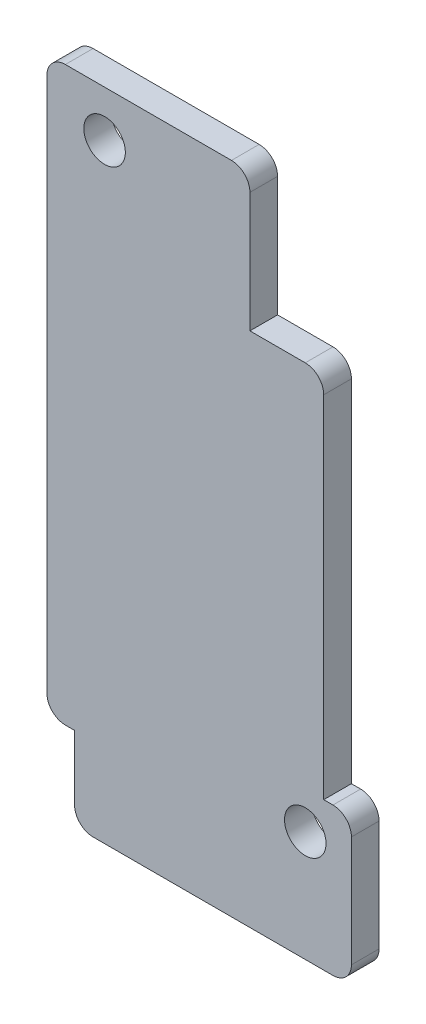
ISO-10303-21;
HEADER;
FILE_DESCRIPTION(('STEP AP214'),'2;1');
FILE_NAME('part.step','',(''),(''),'','','');
FILE_SCHEMA(('AUTOMOTIVE_DESIGN { 1 0 10303 214 1 1 1 1 }'));
ENDSEC;
DATA;
#1=APPLICATION_CONTEXT('core data for automotive mechanical design processes');
#2=APPLICATION_PROTOCOL_DEFINITION('international standard','automotive_design',2000,#1);
#3=PRODUCT_CONTEXT('',#1,'mechanical');
#4=PRODUCT('Part','Part','',(#3));
#5=PRODUCT_RELATED_PRODUCT_CATEGORY('part','',(#4));
#6=PRODUCT_DEFINITION_FORMATION('','',#4);
#7=PRODUCT_DEFINITION_CONTEXT('part definition',#1,'design');
#8=PRODUCT_DEFINITION('design','',#6,#7);
#9=PRODUCT_DEFINITION_SHAPE('','',#8);
#10=(LENGTH_UNIT() NAMED_UNIT(*) SI_UNIT(.MILLI.,.METRE.));
#11=(NAMED_UNIT(*) PLANE_ANGLE_UNIT() SI_UNIT($,.RADIAN.));
#12=(NAMED_UNIT(*) SI_UNIT($,.STERADIAN.) SOLID_ANGLE_UNIT());
#13=UNCERTAINTY_MEASURE_WITH_UNIT(LENGTH_MEASURE(1.E-05),#10,'distance_accuracy_value','');
#14=(GEOMETRIC_REPRESENTATION_CONTEXT(3) GLOBAL_UNCERTAINTY_ASSIGNED_CONTEXT((#13)) GLOBAL_UNIT_ASSIGNED_CONTEXT((#10,
#11,#12)) REPRESENTATION_CONTEXT('',''));
#15=CARTESIAN_POINT('',(0.,0.,0.));
#16=DIRECTION('',(0.,0.,1.));
#17=DIRECTION('',(1.,0.,0.));
#18=AXIS2_PLACEMENT_3D('',#15,#16,#17);
#19=CARTESIAN_POINT('',(15.9441176470588,16.0014705882353,1.5));
#20=DIRECTION('',(-1.,0.,0.));
#21=DIRECTION('',(0.,-1.,0.));
#22=AXIS2_PLACEMENT_3D('',#19,#20,#21);
#23=PLANE('',#22);
#24=DIRECTION('',(0.,1.,0.));
#25=VECTOR('',#24,1.);
#26=CARTESIAN_POINT('',(15.9441176470588,16.0014705882353,-1.5));
#27=LINE('',#26,#25);
#28=CARTESIAN_POINT('',(15.9441176470588,-38.9985294117647,-1.5));
#29=VERTEX_POINT('',#28);
#30=CARTESIAN_POINT('',(15.9441176470588,-0.998529411764711,-1.5));
#31=VERTEX_POINT('',#30);
#32=EDGE_CURVE('E239',#29,#31,#27,.T.);
#33=ORIENTED_EDGE('',*,*,#32,.T.);
#34=DIRECTION('',(0.,0.,1.));
#35=VECTOR('',#34,1.);
#36=CARTESIAN_POINT('',(15.9441176470588,-0.998529411764711,1.5));
#37=LINE('',#36,#35);
#38=CARTESIAN_POINT('',(15.9441176470588,-0.998529411764711,1.5));
#39=VERTEX_POINT('',#38);
#40=EDGE_CURVE('E290',#31,#39,#37,.T.);
#41=ORIENTED_EDGE('',*,*,#40,.T.);
#42=DIRECTION('',(0.,1.,0.));
#43=VECTOR('',#42,1.);
#44=CARTESIAN_POINT('',(15.9441176470588,16.0014705882353,1.5));
#45=LINE('',#44,#43);
#46=CARTESIAN_POINT('',(15.9441176470588,-38.9985294117647,1.5));
#47=VERTEX_POINT('',#46);
#48=EDGE_CURVE('E228',#47,#39,#45,.T.);
#49=ORIENTED_EDGE('',*,*,#48,.F.);
#50=DIRECTION('',(0.,0.,1.));
#51=VECTOR('',#50,1.);
#52=CARTESIAN_POINT('',(15.9441176470588,-38.9985294117647,-1.5));
#53=LINE('',#52,#51);
#54=EDGE_CURVE('E195',#29,#47,#53,.T.);
#55=ORIENTED_EDGE('',*,*,#54,.F.);
#56=EDGE_LOOP('',(#33,#41,#49,#55));
#57=FACE_BOUND('',#56,.T.);
#58=ADVANCED_FACE('F37',(#57),#23,.F.);
#59=CARTESIAN_POINT('',(-14.0558823529412,16.0014705882353,1.5));
#60=DIRECTION('',(1.,0.,0.));
#61=DIRECTION('',(0.,1.,0.));
#62=AXIS2_PLACEMENT_3D('',#59,#60,#61);
#63=PLANE('',#62);
#64=DIRECTION('',(0.,-1.,0.));
#65=VECTOR('',#64,1.);
#66=CARTESIAN_POINT('',(-14.0558823529412,16.0014705882353,-1.5));
#67=LINE('',#66,#65);
#68=CARTESIAN_POINT('',(-14.0558823529412,14.0014705882353,-1.5));
#69=VERTEX_POINT('',#68);
#70=CARTESIAN_POINT('',(-14.0558823529412,-43.9985294117647,-1.5));
#71=VERTEX_POINT('',#70);
#72=EDGE_CURVE('E221',#69,#71,#67,.T.);
#73=ORIENTED_EDGE('',*,*,#72,.T.);
#74=DIRECTION('',(0.,0.,-1.));
#75=VECTOR('',#74,1.);
#76=CARTESIAN_POINT('',(-14.0558823529412,-43.9985294117647,1.5));
#77=LINE('',#76,#75);
#78=CARTESIAN_POINT('',(-14.0558823529412,-43.9985294117647,1.5));
#79=VERTEX_POINT('',#78);
#80=EDGE_CURVE('E60',#71,#79,#77,.F.);
#81=ORIENTED_EDGE('',*,*,#80,.T.);
#82=DIRECTION('',(0.,-1.,0.));
#83=VECTOR('',#82,1.);
#84=CARTESIAN_POINT('',(-14.0558823529412,16.0014705882353,1.5));
#85=LINE('',#84,#83);
#86=CARTESIAN_POINT('',(-14.0558823529412,14.0014705882353,1.5));
#87=VERTEX_POINT('',#86);
#88=EDGE_CURVE('E222',#87,#79,#85,.T.);
#89=ORIENTED_EDGE('',*,*,#88,.F.);
#90=DIRECTION('',(0.,0.,-1.));
#91=VECTOR('',#90,1.);
#92=CARTESIAN_POINT('',(-14.0558823529412,14.0014705882353,1.5));
#93=LINE('',#92,#91);
#94=EDGE_CURVE('E278',#87,#69,#93,.T.);
#95=ORIENTED_EDGE('',*,*,#94,.T.);
#96=EDGE_LOOP('',(#73,#81,#89,#95));
#97=FACE_BOUND('',#96,.T.);
#98=ADVANCED_FACE('F308',(#97),#63,.F.);
#99=CARTESIAN_POINT('',(-14.0558823529412,-54.9985294117647,1.5));
#100=DIRECTION('',(0.,1.,0.));
#101=DIRECTION('',(0.,0.,1.));
#102=AXIS2_PLACEMENT_3D('',#99,#100,#101);
#103=PLANE('',#102);
#104=DIRECTION('',(1.,0.,0.));
#105=VECTOR('',#104,1.);
#106=CARTESIAN_POINT('',(-14.0558823529412,-54.9985294117647,1.5));
#107=LINE('',#106,#105);
#108=CARTESIAN_POINT('',(-9.05588235294117,-54.9985294117647,1.5));
#109=VERTEX_POINT('',#108);
#110=CARTESIAN_POINT('',(16.9441176470588,-54.9985294117647,1.5));
#111=VERTEX_POINT('',#110);
#112=EDGE_CURVE('E224',#109,#111,#107,.T.);
#113=ORIENTED_EDGE('',*,*,#112,.F.);
#114=DIRECTION('',(0.,0.,-1.));
#115=VECTOR('',#114,1.);
#116=CARTESIAN_POINT('',(-9.05588235294116,-54.9985294117647,1.5));
#117=LINE('',#116,#115);
#118=CARTESIAN_POINT('',(-9.05588235294117,-54.9985294117647,-1.5));
#119=VERTEX_POINT('',#118);
#120=EDGE_CURVE('E245',#109,#119,#117,.T.);
#121=ORIENTED_EDGE('',*,*,#120,.T.);
#122=DIRECTION('',(1.,0.,0.));
#123=VECTOR('',#122,1.);
#124=CARTESIAN_POINT('',(-14.0558823529412,-54.9985294117647,-1.5));
#125=LINE('',#124,#123);
#126=CARTESIAN_POINT('',(16.9441176470588,-54.9985294117647,-1.5));
#127=VERTEX_POINT('',#126);
#128=EDGE_CURVE('E236',#119,#127,#125,.T.);
#129=ORIENTED_EDGE('',*,*,#128,.T.);
#130=DIRECTION('',(0.,0.,-1.));
#131=VECTOR('',#130,1.);
#132=CARTESIAN_POINT('',(16.9441176470588,-54.9985294117647,1.5));
#133=LINE('',#132,#131);
#134=EDGE_CURVE('E234',#127,#111,#133,.F.);
#135=ORIENTED_EDGE('',*,*,#134,.T.);
#136=EDGE_LOOP('',(#113,#121,#129,#135));
#137=FACE_BOUND('',#136,.T.);
#138=ADVANCED_FACE('F333',(#137),#103,.F.);
#139=CARTESIAN_POINT('',(-14.0558823529412,16.0014705882353,1.5));
#140=DIRECTION('',(0.,-1.,0.));
#141=DIRECTION('',(0.,0.,-1.));
#142=AXIS2_PLACEMENT_3D('',#139,#140,#141);
#143=PLANE('',#142);
#144=DIRECTION('',(-1.,0.,0.));
#145=VECTOR('',#144,1.);
#146=CARTESIAN_POINT('',(-14.0558823529412,16.0014705882353,1.5));
#147=LINE('',#146,#145);
#148=CARTESIAN_POINT('',(5.94411764705882,16.0014705882353,1.5));
#149=VERTEX_POINT('',#148);
#150=CARTESIAN_POINT('',(-12.0558823529412,16.0014705882353,1.5));
#151=VERTEX_POINT('',#150);
#152=EDGE_CURVE('E231',#149,#151,#147,.T.);
#153=ORIENTED_EDGE('',*,*,#152,.F.);
#154=DIRECTION('',(0.,0.,1.));
#155=VECTOR('',#154,1.);
#156=CARTESIAN_POINT('',(5.94411764705882,16.0014705882353,1.5));
#157=LINE('',#156,#155);
#158=CARTESIAN_POINT('',(5.94411764705882,16.0014705882353,-1.5));
#159=VERTEX_POINT('',#158);
#160=EDGE_CURVE('E11',#149,#159,#157,.F.);
#161=ORIENTED_EDGE('',*,*,#160,.T.);
#162=DIRECTION('',(-1.,0.,0.));
#163=VECTOR('',#162,1.);
#164=CARTESIAN_POINT('',(-14.0558823529412,16.0014705882353,-1.5));
#165=LINE('',#164,#163);
#166=CARTESIAN_POINT('',(-12.0558823529412,16.0014705882353,-1.5));
#167=VERTEX_POINT('',#166);
#168=EDGE_CURVE('E225',#159,#167,#165,.T.);
#169=ORIENTED_EDGE('',*,*,#168,.T.);
#170=DIRECTION('',(0.,0.,-1.));
#171=VECTOR('',#170,1.);
#172=CARTESIAN_POINT('',(-12.0558823529412,16.0014705882353,1.5));
#173=LINE('',#172,#171);
#174=EDGE_CURVE('E45',#167,#151,#173,.F.);
#175=ORIENTED_EDGE('',*,*,#174,.T.);
#176=EDGE_LOOP('',(#153,#161,#169,#175));
#177=FACE_BOUND('',#176,.T.);
#178=ADVANCED_FACE('F300',(#177),#143,.F.);
#179=CARTESIAN_POINT('',(0.,0.,1.5));
#180=DIRECTION('',(0.,0.,1.));
#181=DIRECTION('',(1.,0.,0.));
#182=AXIS2_PLACEMENT_3D('',#179,#180,#181);
#183=PLANE('',#182);
#184=DIRECTION('',(0.,-1.,0.));
#185=VECTOR('',#184,1.);
#186=CARTESIAN_POINT('',(-11.0558823529412,-54.9985294117647,1.5));
#187=LINE('',#186,#185);
#188=CARTESIAN_POINT('',(-11.0558823529412,-45.9985294117647,1.5));
#189=VERTEX_POINT('',#188);
#190=CARTESIAN_POINT('',(-11.0558823529412,-52.9985294117647,1.5));
#191=VERTEX_POINT('',#190);
#192=EDGE_CURVE('E160',#189,#191,#187,.T.);
#193=ORIENTED_EDGE('',*,*,#192,.T.);
#194=CARTESIAN_POINT('',(-9.05588235294116,-52.9985294117647,1.5));
#195=DIRECTION('',(0.,0.,1.));
#196=DIRECTION('',(1.,0.,0.));
#197=AXIS2_PLACEMENT_3D('',#194,#195,#196);
#198=CIRCLE('',#197,2.);
#199=EDGE_CURVE('E274',#191,#109,#198,.T.);
#200=ORIENTED_EDGE('',*,*,#199,.T.);
#201=ORIENTED_EDGE('',*,*,#112,.T.);
#202=CARTESIAN_POINT('',(16.9441176470588,-52.9985294117647,1.5));
#203=DIRECTION('',(0.,0.,1.));
#204=DIRECTION('',(1.,0.,0.));
#205=AXIS2_PLACEMENT_3D('',#202,#203,#204);
#206=CIRCLE('',#205,2.);
#207=CARTESIAN_POINT('',(18.9441176470588,-52.9985294117647,1.5));
#208=VERTEX_POINT('',#207);
#209=EDGE_CURVE('E269',#111,#208,#206,.T.);
#210=ORIENTED_EDGE('',*,*,#209,.T.);
#211=DIRECTION('',(0.,-1.,0.));
#212=VECTOR('',#211,1.);
#213=CARTESIAN_POINT('',(18.9441176470588,-54.9985294117647,1.5));
#214=LINE('',#213,#212);
#215=CARTESIAN_POINT('',(18.9441176470588,-40.9985294117647,1.5));
#216=VERTEX_POINT('',#215);
#217=EDGE_CURVE('E199',#216,#208,#214,.T.);
#218=ORIENTED_EDGE('',*,*,#217,.F.);
#219=CARTESIAN_POINT('',(16.9441176470588,-40.9985294117647,1.5));
#220=DIRECTION('',(0.,0.,1.));
#221=DIRECTION('',(1.,0.,0.));
#222=AXIS2_PLACEMENT_3D('',#219,#220,#221);
#223=CIRCLE('',#222,2.);
#224=CARTESIAN_POINT('',(16.9441176470588,-38.9985294117647,1.5));
#225=VERTEX_POINT('',#224);
#226=EDGE_CURVE('E271',#216,#225,#223,.T.);
#227=ORIENTED_EDGE('',*,*,#226,.T.);
#228=DIRECTION('',(-1.,0.,0.));
#229=VECTOR('',#228,1.);
#230=CARTESIAN_POINT('',(18.9441176470588,-38.9985294117647,1.5));
#231=LINE('',#230,#229);
#232=EDGE_CURVE('E202',#225,#47,#231,.T.);
#233=ORIENTED_EDGE('',*,*,#232,.T.);
#234=ORIENTED_EDGE('',*,*,#48,.T.);
#235=CARTESIAN_POINT('',(13.9441176470588,-0.998529411764711,1.5));
#236=DIRECTION('',(0.,0.,1.));
#237=DIRECTION('',(1.,0.,0.));
#238=AXIS2_PLACEMENT_3D('',#235,#236,#237);
#239=CIRCLE('',#238,2.);
#240=CARTESIAN_POINT('',(13.9441176470588,1.00147058823529,1.5));
#241=VERTEX_POINT('',#240);
#242=EDGE_CURVE('E267',#39,#241,#239,.T.);
#243=ORIENTED_EDGE('',*,*,#242,.T.);
#244=DIRECTION('',(1.,0.,0.));
#245=VECTOR('',#244,1.);
#246=CARTESIAN_POINT('',(15.9441176470588,1.00147058823529,1.5));
#247=LINE('',#246,#245);
#248=CARTESIAN_POINT('',(7.94411764705882,1.00147058823529,1.5));
#249=VERTEX_POINT('',#248);
#250=EDGE_CURVE('E212',#249,#241,#247,.T.);
#251=ORIENTED_EDGE('',*,*,#250,.F.);
#252=DIRECTION('',(0.,-1.,0.));
#253=VECTOR('',#252,1.);
#254=CARTESIAN_POINT('',(7.94411764705882,16.0014705882353,1.5));
#255=LINE('',#254,#253);
#256=CARTESIAN_POINT('',(7.94411764705882,14.0014705882353,1.5));
#257=VERTEX_POINT('',#256);
#258=EDGE_CURVE('E208',#257,#249,#255,.T.);
#259=ORIENTED_EDGE('',*,*,#258,.F.);
#260=CARTESIAN_POINT('',(5.94411764705882,14.0014705882353,1.5));
#261=DIRECTION('',(0.,0.,1.));
#262=DIRECTION('',(1.,0.,0.));
#263=AXIS2_PLACEMENT_3D('',#260,#261,#262);
#264=CIRCLE('',#263,2.);
#265=EDGE_CURVE('E265',#257,#149,#264,.T.);
#266=ORIENTED_EDGE('',*,*,#265,.T.);
#267=ORIENTED_EDGE('',*,*,#152,.T.);
#268=CARTESIAN_POINT('',(-12.0558823529412,14.0014705882353,1.5));
#269=DIRECTION('',(0.,0.,1.));
#270=DIRECTION('',(1.,0.,0.));
#271=AXIS2_PLACEMENT_3D('',#268,#269,#270);
#272=CIRCLE('',#271,2.);
#273=EDGE_CURVE('E263',#151,#87,#272,.T.);
#274=ORIENTED_EDGE('',*,*,#273,.T.);
#275=ORIENTED_EDGE('',*,*,#88,.T.);
#276=CARTESIAN_POINT('',(-12.0558823529412,-43.9985294117647,1.5));
#277=DIRECTION('',(0.,0.,1.));
#278=DIRECTION('',(1.,0.,0.));
#279=AXIS2_PLACEMENT_3D('',#276,#277,#278);
#280=CIRCLE('',#279,2.);
#281=CARTESIAN_POINT('',(-12.0558823529412,-45.9985294117647,1.5));
#282=VERTEX_POINT('',#281);
#283=EDGE_CURVE('E52',#79,#282,#280,.T.);
#284=ORIENTED_EDGE('',*,*,#283,.T.);
#285=DIRECTION('',(1.,0.,0.));
#286=VECTOR('',#285,1.);
#287=CARTESIAN_POINT('',(-14.0558823529412,-45.9985294117647,1.5));
#288=LINE('',#287,#286);
#289=EDGE_CURVE('E155',#282,#189,#288,.T.);
#290=ORIENTED_EDGE('',*,*,#289,.T.);
#291=EDGE_LOOP('',(#193,#200,#201,#210,#218,#227,#233,#234,#243,#251,#259,#266,#267,#274,#275,
#284,#290));
#292=FACE_BOUND('',#291,.T.);
#293=CARTESIAN_POINT('',(-7.80588235294117,11.0014705882353,1.5));
#294=DIRECTION('',(0.,0.,-1.));
#295=DIRECTION('',(-1.,0.,0.));
#296=AXIS2_PLACEMENT_3D('',#293,#294,#295);
#297=CIRCLE('',#296,2.25);
#298=CARTESIAN_POINT('',(-10.0558823529412,11.0014705882353,1.5));
#299=VERTEX_POINT('',#298);
#300=EDGE_CURVE('E186',#299,#299,#297,.T.);
#301=ORIENTED_EDGE('',*,*,#300,.T.);
#302=EDGE_LOOP('',(#301));
#303=FACE_BOUND('',#302,.T.);
#304=CARTESIAN_POINT('',(13.9441176470588,-42.9985294117647,1.5));
#305=DIRECTION('',(0.,0.,-1.));
#306=DIRECTION('',(-1.,0.,0.));
#307=AXIS2_PLACEMENT_3D('',#304,#305,#306);
#308=CIRCLE('',#307,2.25);
#309=CARTESIAN_POINT('',(11.6941176470588,-42.9985294117647,1.5));
#310=VERTEX_POINT('',#309);
#311=EDGE_CURVE('E192',#310,#310,#308,.T.);
#312=ORIENTED_EDGE('',*,*,#311,.T.);
#313=EDGE_LOOP('',(#312));
#314=FACE_BOUND('',#313,.T.);
#315=ADVANCED_FACE('F157',(#292,#303,#314),#183,.T.);
#316=CARTESIAN_POINT('',(0.,0.,-1.5));
#317=DIRECTION('',(0.,0.,1.));
#318=DIRECTION('',(1.,0.,0.));
#319=AXIS2_PLACEMENT_3D('',#316,#317,#318);
#320=PLANE('',#319);
#321=CARTESIAN_POINT('',(-7.80588235294117,11.0014705882353,-1.5));
#322=DIRECTION('',(0.,0.,-1.));
#323=DIRECTION('',(-1.,0.,0.));
#324=AXIS2_PLACEMENT_3D('',#321,#322,#323);
#325=CIRCLE('',#324,2.25);
#326=CARTESIAN_POINT('',(-10.0558823529412,11.0014705882353,-1.5));
#327=VERTEX_POINT('',#326);
#328=EDGE_CURVE('E175',#327,#327,#325,.T.);
#329=ORIENTED_EDGE('',*,*,#328,.F.);
#330=EDGE_LOOP('',(#329));
#331=FACE_BOUND('',#330,.T.);
#332=CARTESIAN_POINT('',(13.9441176470588,-42.9985294117647,-1.5));
#333=DIRECTION('',(0.,0.,-1.));
#334=DIRECTION('',(-1.,0.,0.));
#335=AXIS2_PLACEMENT_3D('',#332,#333,#334);
#336=CIRCLE('',#335,2.25);
#337=CARTESIAN_POINT('',(11.6941176470588,-42.9985294117647,-1.5));
#338=VERTEX_POINT('',#337);
#339=EDGE_CURVE('E189',#338,#338,#336,.T.);
#340=ORIENTED_EDGE('',*,*,#339,.F.);
#341=EDGE_LOOP('',(#340));
#342=FACE_BOUND('',#341,.T.);
#343=ORIENTED_EDGE('',*,*,#128,.F.);
#344=CARTESIAN_POINT('',(-9.05588235294116,-52.9985294117647,-1.5));
#345=DIRECTION('',(0.,0.,1.));
#346=DIRECTION('',(1.,0.,0.));
#347=AXIS2_PLACEMENT_3D('',#344,#345,#346);
#348=CIRCLE('',#347,2.);
#349=CARTESIAN_POINT('',(-11.0558823529412,-52.9985294117647,-1.5));
#350=VERTEX_POINT('',#349);
#351=EDGE_CURVE('E260',#119,#350,#348,.F.);
#352=ORIENTED_EDGE('',*,*,#351,.T.);
#353=DIRECTION('',(0.,-1.,0.));
#354=VECTOR('',#353,1.);
#355=CARTESIAN_POINT('',(-11.0558823529412,-54.9985294117647,-1.5));
#356=LINE('',#355,#354);
#357=CARTESIAN_POINT('',(-11.0558823529412,-45.9985294117647,-1.5));
#358=VERTEX_POINT('',#357);
#359=EDGE_CURVE('E165',#358,#350,#356,.T.);
#360=ORIENTED_EDGE('',*,*,#359,.F.);
#361=DIRECTION('',(1.,0.,0.));
#362=VECTOR('',#361,1.);
#363=CARTESIAN_POINT('',(-14.0558823529412,-45.9985294117647,-1.5));
#364=LINE('',#363,#362);
#365=CARTESIAN_POINT('',(-12.0558823529412,-45.9985294117647,-1.5));
#366=VERTEX_POINT('',#365);
#367=EDGE_CURVE('E171',#366,#358,#364,.T.);
#368=ORIENTED_EDGE('',*,*,#367,.F.);
#369=CARTESIAN_POINT('',(-12.0558823529412,-43.9985294117647,-1.5));
#370=DIRECTION('',(0.,0.,1.));
#371=DIRECTION('',(1.,0.,0.));
#372=AXIS2_PLACEMENT_3D('',#369,#370,#371);
#373=CIRCLE('',#372,2.);
#374=EDGE_CURVE('E258',#366,#71,#373,.F.);
#375=ORIENTED_EDGE('',*,*,#374,.T.);
#376=ORIENTED_EDGE('',*,*,#72,.F.);
#377=CARTESIAN_POINT('',(-12.0558823529412,14.0014705882353,-1.5));
#378=DIRECTION('',(0.,0.,1.));
#379=DIRECTION('',(1.,0.,0.));
#380=AXIS2_PLACEMENT_3D('',#377,#378,#379);
#381=CIRCLE('',#380,2.);
#382=EDGE_CURVE('E248',#69,#167,#381,.F.);
#383=ORIENTED_EDGE('',*,*,#382,.T.);
#384=ORIENTED_EDGE('',*,*,#168,.F.);
#385=CARTESIAN_POINT('',(5.94411764705882,14.0014705882353,-1.5));
#386=DIRECTION('',(0.,0.,1.));
#387=DIRECTION('',(1.,0.,0.));
#388=AXIS2_PLACEMENT_3D('',#385,#386,#387);
#389=CIRCLE('',#388,2.);
#390=CARTESIAN_POINT('',(7.94411764705882,14.0014705882353,-1.5));
#391=VERTEX_POINT('',#390);
#392=EDGE_CURVE('E250',#159,#391,#389,.F.);
#393=ORIENTED_EDGE('',*,*,#392,.T.);
#394=DIRECTION('',(0.,-1.,0.));
#395=VECTOR('',#394,1.);
#396=CARTESIAN_POINT('',(7.94411764705882,16.0014705882353,-1.5));
#397=LINE('',#396,#395);
#398=CARTESIAN_POINT('',(7.94411764705882,1.00147058823529,-1.5));
#399=VERTEX_POINT('',#398);
#400=EDGE_CURVE('E209',#391,#399,#397,.T.);
#401=ORIENTED_EDGE('',*,*,#400,.T.);
#402=DIRECTION('',(1.,0.,0.));
#403=VECTOR('',#402,1.);
#404=CARTESIAN_POINT('',(15.9441176470588,1.00147058823529,-1.5));
#405=LINE('',#404,#403);
#406=CARTESIAN_POINT('',(13.9441176470588,1.00147058823529,-1.5));
#407=VERTEX_POINT('',#406);
#408=EDGE_CURVE('E211',#399,#407,#405,.T.);
#409=ORIENTED_EDGE('',*,*,#408,.T.);
#410=CARTESIAN_POINT('',(13.9441176470588,-0.998529411764711,-1.5));
#411=DIRECTION('',(0.,0.,1.));
#412=DIRECTION('',(1.,0.,0.));
#413=AXIS2_PLACEMENT_3D('',#410,#411,#412);
#414=CIRCLE('',#413,2.);
#415=EDGE_CURVE('E252',#407,#31,#414,.F.);
#416=ORIENTED_EDGE('',*,*,#415,.T.);
#417=ORIENTED_EDGE('',*,*,#32,.F.);
#418=DIRECTION('',(-1.,0.,0.));
#419=VECTOR('',#418,1.);
#420=CARTESIAN_POINT('',(18.9441176470588,-38.9985294117647,-1.5));
#421=LINE('',#420,#419);
#422=CARTESIAN_POINT('',(16.9441176470588,-38.9985294117647,-1.5));
#423=VERTEX_POINT('',#422);
#424=EDGE_CURVE('E206',#423,#29,#421,.T.);
#425=ORIENTED_EDGE('',*,*,#424,.F.);
#426=CARTESIAN_POINT('',(16.9441176470588,-40.9985294117647,-1.5));
#427=DIRECTION('',(0.,0.,1.));
#428=DIRECTION('',(1.,0.,0.));
#429=AXIS2_PLACEMENT_3D('',#426,#427,#428);
#430=CIRCLE('',#429,2.);
#431=CARTESIAN_POINT('',(18.9441176470588,-40.9985294117647,-1.5));
#432=VERTEX_POINT('',#431);
#433=EDGE_CURVE('E256',#423,#432,#430,.F.);
#434=ORIENTED_EDGE('',*,*,#433,.T.);
#435=DIRECTION('',(0.,1.,0.));
#436=VECTOR('',#435,1.);
#437=CARTESIAN_POINT('',(18.9441176470588,-54.9985294117647,-1.5));
#438=LINE('',#437,#436);
#439=CARTESIAN_POINT('',(18.9441176470588,-52.9985294117647,-1.5));
#440=VERTEX_POINT('',#439);
#441=EDGE_CURVE('E196',#440,#432,#438,.T.);
#442=ORIENTED_EDGE('',*,*,#441,.F.);
#443=CARTESIAN_POINT('',(16.9441176470588,-52.9985294117647,-1.5));
#444=DIRECTION('',(0.,0.,1.));
#445=DIRECTION('',(1.,0.,0.));
#446=AXIS2_PLACEMENT_3D('',#443,#444,#445);
#447=CIRCLE('',#446,2.);
#448=EDGE_CURVE('E254',#440,#127,#447,.F.);
#449=ORIENTED_EDGE('',*,*,#448,.T.);
#450=EDGE_LOOP('',(#343,#352,#360,#368,#375,#376,#383,#384,#393,#401,#409,#416,#417,#425,#434,
#442,#449));
#451=FACE_BOUND('',#450,.T.);
#452=ADVANCED_FACE('F311',(#331,#342,#451),#320,.F.);
#453=CARTESIAN_POINT('',(15.9441176470588,1.00147058823529,-1.5));
#454=DIRECTION('',(0.,-1.,0.));
#455=DIRECTION('',(1.,0.,0.));
#456=AXIS2_PLACEMENT_3D('',#453,#454,#455);
#457=PLANE('',#456);
#458=ORIENTED_EDGE('',*,*,#250,.T.);
#459=DIRECTION('',(0.,0.,1.));
#460=VECTOR('',#459,1.);
#461=CARTESIAN_POINT('',(13.9441176470588,1.00147058823529,-1.5));
#462=LINE('',#461,#460);
#463=EDGE_CURVE('E293',#241,#407,#462,.F.);
#464=ORIENTED_EDGE('',*,*,#463,.T.);
#465=ORIENTED_EDGE('',*,*,#408,.F.);
#466=DIRECTION('',(0.,0.,1.));
#467=VECTOR('',#466,1.);
#468=CARTESIAN_POINT('',(7.94411764705882,1.00147058823529,-1.5));
#469=LINE('',#468,#467);
#470=EDGE_CURVE('E215',#399,#249,#469,.T.);
#471=ORIENTED_EDGE('',*,*,#470,.T.);
#472=EDGE_LOOP('',(#458,#464,#465,#471));
#473=FACE_BOUND('',#472,.T.);
#474=ADVANCED_FACE('F371',(#473),#457,.F.);
#475=CARTESIAN_POINT('',(7.94411764705882,16.0014705882353,-1.5));
#476=DIRECTION('',(-1.,0.,0.));
#477=DIRECTION('',(0.,0.,1.));
#478=AXIS2_PLACEMENT_3D('',#475,#476,#477);
#479=PLANE('',#478);
#480=ORIENTED_EDGE('',*,*,#400,.F.);
#481=DIRECTION('',(0.,0.,1.));
#482=VECTOR('',#481,1.);
#483=CARTESIAN_POINT('',(7.94411764705882,14.0014705882353,-1.5));
#484=LINE('',#483,#482);
#485=EDGE_CURVE('E295',#391,#257,#484,.T.);
#486=ORIENTED_EDGE('',*,*,#485,.T.);
#487=ORIENTED_EDGE('',*,*,#258,.T.);
#488=ORIENTED_EDGE('',*,*,#470,.F.);
#489=EDGE_LOOP('',(#480,#486,#487,#488));
#490=FACE_BOUND('',#489,.T.);
#491=ADVANCED_FACE('F375',(#490),#479,.F.);
#492=CARTESIAN_POINT('',(18.9441176470588,-38.9985294117647,-1.5));
#493=DIRECTION('',(0.,-1.,0.));
#494=DIRECTION('',(1.,0.,0.));
#495=AXIS2_PLACEMENT_3D('',#492,#493,#494);
#496=PLANE('',#495);
#497=ORIENTED_EDGE('',*,*,#232,.F.);
#498=DIRECTION('',(0.,0.,1.));
#499=VECTOR('',#498,1.);
#500=CARTESIAN_POINT('',(16.9441176470588,-38.9985294117647,-1.5));
#501=LINE('',#500,#499);
#502=EDGE_CURVE('E288',#225,#423,#501,.F.);
#503=ORIENTED_EDGE('',*,*,#502,.T.);
#504=ORIENTED_EDGE('',*,*,#424,.T.);
#505=ORIENTED_EDGE('',*,*,#54,.T.);
#506=EDGE_LOOP('',(#497,#503,#504,#505));
#507=FACE_BOUND('',#506,.T.);
#508=ADVANCED_FACE('F359',(#507),#496,.F.);
#509=CARTESIAN_POINT('',(18.9441176470588,0.,0.));
#510=DIRECTION('',(1.,0.,0.));
#511=DIRECTION('',(0.,1.,0.));
#512=AXIS2_PLACEMENT_3D('',#509,#510,#511);
#513=PLANE('',#512);
#514=ORIENTED_EDGE('',*,*,#441,.T.);
#515=DIRECTION('',(0.,0.,1.));
#516=VECTOR('',#515,1.);
#517=CARTESIAN_POINT('',(18.9441176470588,-40.9985294117647,1.5));
#518=LINE('',#517,#516);
#519=EDGE_CURVE('E285',#432,#216,#518,.T.);
#520=ORIENTED_EDGE('',*,*,#519,.T.);
#521=ORIENTED_EDGE('',*,*,#217,.T.);
#522=DIRECTION('',(0.,0.,-1.));
#523=VECTOR('',#522,1.);
#524=CARTESIAN_POINT('',(18.9441176470588,-52.9985294117647,-1.5));
#525=LINE('',#524,#523);
#526=EDGE_CURVE('E282',#208,#440,#525,.T.);
#527=ORIENTED_EDGE('',*,*,#526,.T.);
#528=EDGE_LOOP('',(#514,#520,#521,#527));
#529=FACE_BOUND('',#528,.T.);
#530=ADVANCED_FACE('F352',(#529),#513,.T.);
#531=CARTESIAN_POINT('',(13.9441176470588,-42.9985294117647,-1.5));
#532=DIRECTION('',(0.,0.,-1.));
#533=DIRECTION('',(-1.,0.,0.));
#534=AXIS2_PLACEMENT_3D('',#531,#532,#533);
#535=CYLINDRICAL_SURFACE('',#534,2.25);
#536=ORIENTED_EDGE('',*,*,#311,.F.);
#537=EDGE_LOOP('',(#536));
#538=FACE_BOUND('',#537,.T.);
#539=ORIENTED_EDGE('',*,*,#339,.T.);
#540=EDGE_LOOP('',(#539));
#541=FACE_BOUND('',#540,.T.);
#542=ADVANCED_FACE('F447',(#538,#541),#535,.F.);
#543=CARTESIAN_POINT('',(-7.80588235294117,11.0014705882353,-1.5));
#544=DIRECTION('',(0.,0.,-1.));
#545=DIRECTION('',(-1.,0.,0.));
#546=AXIS2_PLACEMENT_3D('',#543,#544,#545);
#547=CYLINDRICAL_SURFACE('',#546,2.25);
#548=ORIENTED_EDGE('',*,*,#300,.F.);
#549=EDGE_LOOP('',(#548));
#550=FACE_BOUND('',#549,.T.);
#551=ORIENTED_EDGE('',*,*,#328,.T.);
#552=EDGE_LOOP('',(#551));
#553=FACE_BOUND('',#552,.T.);
#554=ADVANCED_FACE('F438',(#550,#553),#547,.F.);
#555=CARTESIAN_POINT('',(-11.0558823529412,-54.9985294117647,1.5));
#556=DIRECTION('',(1.,0.,0.));
#557=DIRECTION('',(0.,0.,-1.));
#558=AXIS2_PLACEMENT_3D('',#555,#556,#557);
#559=PLANE('',#558);
#560=ORIENTED_EDGE('',*,*,#359,.T.);
#561=DIRECTION('',(0.,0.,-1.));
#562=VECTOR('',#561,1.);
#563=CARTESIAN_POINT('',(-11.0558823529412,-52.9985294117647,1.5));
#564=LINE('',#563,#562);
#565=EDGE_CURVE('E179',#350,#191,#564,.F.);
#566=ORIENTED_EDGE('',*,*,#565,.T.);
#567=ORIENTED_EDGE('',*,*,#192,.F.);
#568=DIRECTION('',(0.,0.,-1.));
#569=VECTOR('',#568,1.);
#570=CARTESIAN_POINT('',(-11.0558823529412,-45.9985294117647,1.5));
#571=LINE('',#570,#569);
#572=EDGE_CURVE('E168',#189,#358,#571,.T.);
#573=ORIENTED_EDGE('',*,*,#572,.T.);
#574=EDGE_LOOP('',(#560,#566,#567,#573));
#575=FACE_BOUND('',#574,.T.);
#576=ADVANCED_FACE('F177',(#575),#559,.F.);
#577=CARTESIAN_POINT('',(-14.0558823529412,-45.9985294117647,1.5));
#578=DIRECTION('',(0.,1.,0.));
#579=DIRECTION('',(0.,0.,1.));
#580=AXIS2_PLACEMENT_3D('',#577,#578,#579);
#581=PLANE('',#580);
#582=ORIENTED_EDGE('',*,*,#289,.F.);
#583=DIRECTION('',(0.,0.,-1.));
#584=VECTOR('',#583,1.);
#585=CARTESIAN_POINT('',(-12.0558823529412,-45.9985294117647,1.5));
#586=LINE('',#585,#584);
#587=EDGE_CURVE('E276',#282,#366,#586,.T.);
#588=ORIENTED_EDGE('',*,*,#587,.T.);
#589=ORIENTED_EDGE('',*,*,#367,.T.);
#590=ORIENTED_EDGE('',*,*,#572,.F.);
#591=EDGE_LOOP('',(#582,#588,#589,#590));
#592=FACE_BOUND('',#591,.T.);
#593=ADVANCED_FACE('F169',(#592),#581,.F.);
#594=CARTESIAN_POINT('',(-9.05588235294116,-52.9985294117647,1.5));
#595=DIRECTION('',(0.,0.,-1.));
#596=DIRECTION('',(-1.,0.,0.));
#597=AXIS2_PLACEMENT_3D('',#594,#595,#596);
#598=CYLINDRICAL_SURFACE('',#597,2.);
#599=ORIENTED_EDGE('',*,*,#199,.F.);
#600=ORIENTED_EDGE('',*,*,#565,.F.);
#601=ORIENTED_EDGE('',*,*,#351,.F.);
#602=ORIENTED_EDGE('',*,*,#120,.F.);
#603=EDGE_LOOP('',(#599,#600,#601,#602));
#604=FACE_BOUND('',#603,.T.);
#605=ADVANCED_FACE('F316',(#604),#598,.T.);
#606=CARTESIAN_POINT('',(-12.0558823529412,-43.9985294117647,1.5));
#607=DIRECTION('',(0.,0.,-1.));
#608=DIRECTION('',(-1.,0.,0.));
#609=AXIS2_PLACEMENT_3D('',#606,#607,#608);
#610=CYLINDRICAL_SURFACE('',#609,2.);
#611=ORIENTED_EDGE('',*,*,#283,.F.);
#612=ORIENTED_EDGE('',*,*,#80,.F.);
#613=ORIENTED_EDGE('',*,*,#374,.F.);
#614=ORIENTED_EDGE('',*,*,#587,.F.);
#615=EDGE_LOOP('',(#611,#612,#613,#614));
#616=FACE_BOUND('',#615,.T.);
#617=ADVANCED_FACE('F313',(#616),#610,.T.);
#618=CARTESIAN_POINT('',(16.9441176470588,-40.9985294117647,0.));
#619=DIRECTION('',(0.,0.,-1.));
#620=DIRECTION('',(-1.,0.,0.));
#621=AXIS2_PLACEMENT_3D('',#618,#619,#620);
#622=CYLINDRICAL_SURFACE('',#621,2.);
#623=ORIENTED_EDGE('',*,*,#433,.F.);
#624=ORIENTED_EDGE('',*,*,#502,.F.);
#625=ORIENTED_EDGE('',*,*,#226,.F.);
#626=ORIENTED_EDGE('',*,*,#519,.F.);
#627=EDGE_LOOP('',(#623,#624,#625,#626));
#628=FACE_BOUND('',#627,.T.);
#629=ADVANCED_FACE('F315',(#628),#622,.T.);
#630=CARTESIAN_POINT('',(16.9441176470588,-52.9985294117647,0.));
#631=DIRECTION('',(0.,0.,1.));
#632=DIRECTION('',(1.,0.,0.));
#633=AXIS2_PLACEMENT_3D('',#630,#631,#632);
#634=CYLINDRICAL_SURFACE('',#633,2.);
#635=ORIENTED_EDGE('',*,*,#209,.F.);
#636=ORIENTED_EDGE('',*,*,#134,.F.);
#637=ORIENTED_EDGE('',*,*,#448,.F.);
#638=ORIENTED_EDGE('',*,*,#526,.F.);
#639=EDGE_LOOP('',(#635,#636,#637,#638));
#640=FACE_BOUND('',#639,.T.);
#641=ADVANCED_FACE('F322',(#640),#634,.T.);
#642=CARTESIAN_POINT('',(13.9441176470588,-0.998529411764711,1.5));
#643=DIRECTION('',(0.,0.,1.));
#644=DIRECTION('',(1.,0.,0.));
#645=AXIS2_PLACEMENT_3D('',#642,#643,#644);
#646=CYLINDRICAL_SURFACE('',#645,2.);
#647=ORIENTED_EDGE('',*,*,#415,.F.);
#648=ORIENTED_EDGE('',*,*,#463,.F.);
#649=ORIENTED_EDGE('',*,*,#242,.F.);
#650=ORIENTED_EDGE('',*,*,#40,.F.);
#651=EDGE_LOOP('',(#647,#648,#649,#650));
#652=FACE_BOUND('',#651,.T.);
#653=ADVANCED_FACE('F368',(#652),#646,.T.);
#654=CARTESIAN_POINT('',(5.94411764705882,14.0014705882353,-1.5));
#655=DIRECTION('',(0.,0.,1.));
#656=DIRECTION('',(1.,0.,0.));
#657=AXIS2_PLACEMENT_3D('',#654,#655,#656);
#658=CYLINDRICAL_SURFACE('',#657,2.);
#659=ORIENTED_EDGE('',*,*,#392,.F.);
#660=ORIENTED_EDGE('',*,*,#160,.F.);
#661=ORIENTED_EDGE('',*,*,#265,.F.);
#662=ORIENTED_EDGE('',*,*,#485,.F.);
#663=EDGE_LOOP('',(#659,#660,#661,#662));
#664=FACE_BOUND('',#663,.T.);
#665=ADVANCED_FACE('F379',(#664),#658,.T.);
#666=CARTESIAN_POINT('',(-12.0558823529412,14.0014705882353,1.5));
#667=DIRECTION('',(0.,0.,-1.));
#668=DIRECTION('',(-1.,0.,0.));
#669=AXIS2_PLACEMENT_3D('',#666,#667,#668);
#670=CYLINDRICAL_SURFACE('',#669,2.);
#671=ORIENTED_EDGE('',*,*,#273,.F.);
#672=ORIENTED_EDGE('',*,*,#174,.F.);
#673=ORIENTED_EDGE('',*,*,#382,.F.);
#674=ORIENTED_EDGE('',*,*,#94,.F.);
#675=EDGE_LOOP('',(#671,#672,#673,#674));
#676=FACE_BOUND('',#675,.T.);
#677=ADVANCED_FACE('F39',(#676),#670,.T.);
#678=CLOSED_SHELL('',(#58,#98,#138,#178,#315,#452,#474,#491,#508,#530,#542,#554,#576,#593,#605,
#617,#629,#641,#653,#665,#677));
#679=MANIFOLD_SOLID_BREP('B2',#678);
#680=ADVANCED_BREP_SHAPE_REPRESENTATION('',(#18,#679),#14);
#681=SHAPE_DEFINITION_REPRESENTATION(#9,#680);
ENDSEC;
END-ISO-10303-21;
